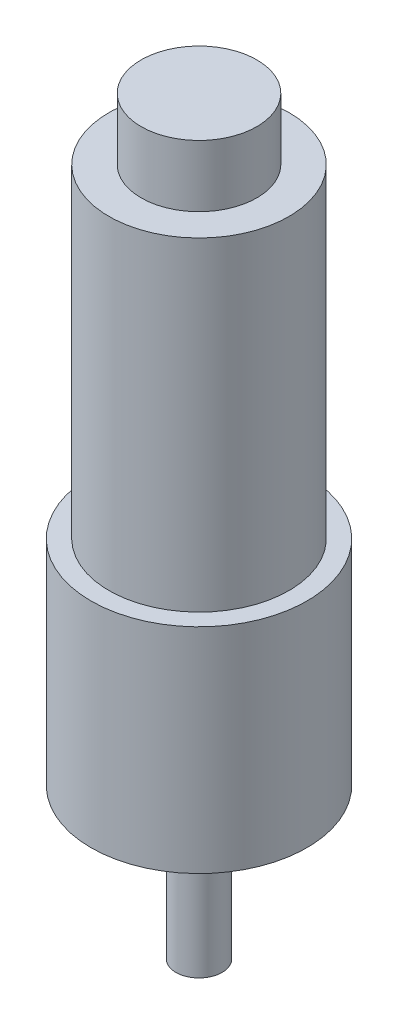
ISO-10303-21;
HEADER;
FILE_DESCRIPTION(('STEP AP214'),'2;1');
FILE_NAME('part.step','',(''),(''),'','','');
FILE_SCHEMA(('AUTOMOTIVE_DESIGN { 1 0 10303 214 1 1 1 1 }'));
ENDSEC;
DATA;
#1=APPLICATION_CONTEXT('core data for automotive mechanical design processes');
#2=APPLICATION_PROTOCOL_DEFINITION('international standard','automotive_design',2000,#1);
#3=PRODUCT_CONTEXT('',#1,'mechanical');
#4=PRODUCT('Part','Part','',(#3));
#5=PRODUCT_RELATED_PRODUCT_CATEGORY('part','',(#4));
#6=PRODUCT_DEFINITION_FORMATION('','',#4);
#7=PRODUCT_DEFINITION_CONTEXT('part definition',#1,'design');
#8=PRODUCT_DEFINITION('design','',#6,#7);
#9=PRODUCT_DEFINITION_SHAPE('','',#8);
#10=(LENGTH_UNIT() NAMED_UNIT(*) SI_UNIT(.MILLI.,.METRE.));
#11=(NAMED_UNIT(*) PLANE_ANGLE_UNIT() SI_UNIT($,.RADIAN.));
#12=(NAMED_UNIT(*) SI_UNIT($,.STERADIAN.) SOLID_ANGLE_UNIT());
#13=UNCERTAINTY_MEASURE_WITH_UNIT(LENGTH_MEASURE(1.E-05),#10,'distance_accuracy_value','');
#14=(GEOMETRIC_REPRESENTATION_CONTEXT(3) GLOBAL_UNCERTAINTY_ASSIGNED_CONTEXT((#13)) GLOBAL_UNIT_ASSIGNED_CONTEXT((#10,
#11,#12)) REPRESENTATION_CONTEXT('',''));
#15=CARTESIAN_POINT('',(0.,0.,0.));
#16=DIRECTION('',(0.,0.,1.));
#17=DIRECTION('',(1.,0.,0.));
#18=AXIS2_PLACEMENT_3D('',#15,#16,#17);
#19=CARTESIAN_POINT('',(0.,-1.,0.));
#20=DIRECTION('',(0.,-1.,0.));
#21=DIRECTION('',(0.,0.,-1.));
#22=AXIS2_PLACEMENT_3D('',#19,#20,#21);
#23=PLANE('',#22);
#24=CARTESIAN_POINT('',(0.,-1.,0.));
#25=DIRECTION('',(0.,-1.,0.));
#26=DIRECTION('',(0.,0.,-1.));
#27=AXIS2_PLACEMENT_3D('',#24,#25,#26);
#28=CIRCLE('',#27,8.);
#29=CARTESIAN_POINT('',(0.,-1.,-8.));
#30=VERTEX_POINT('',#29);
#31=EDGE_CURVE('E76',#30,#30,#28,.T.);
#32=ORIENTED_EDGE('',*,*,#31,.T.);
#33=EDGE_LOOP('',(#32));
#34=FACE_BOUND('',#33,.T.);
#35=CARTESIAN_POINT('',(0.,-1.,0.));
#36=DIRECTION('',(0.,-1.,0.));
#37=DIRECTION('',(0.,0.,-1.));
#38=AXIS2_PLACEMENT_3D('',#35,#36,#37);
#39=CIRCLE('',#38,3.);
#40=CARTESIAN_POINT('',(0.,-1.,-3.));
#41=VERTEX_POINT('',#40);
#42=EDGE_CURVE('E73',#41,#41,#39,.T.);
#43=ORIENTED_EDGE('',*,*,#42,.F.);
#44=EDGE_LOOP('',(#43));
#45=FACE_BOUND('',#44,.T.);
#46=ADVANCED_FACE('F34',(#34,#45),#23,.T.);
#47=CARTESIAN_POINT('',(0.,0.,0.));
#48=DIRECTION('',(0.,1.,0.));
#49=DIRECTION('',(0.,0.,1.));
#50=AXIS2_PLACEMENT_3D('',#47,#48,#49);
#51=PLANE('',#50);
#52=CARTESIAN_POINT('',(-11.,0.,1.1521895091661E-13));
#53=DIRECTION('',(0.,-1.,0.));
#54=DIRECTION('',(0.,0.,-1.));
#55=AXIS2_PLACEMENT_3D('',#52,#53,#54);
#56=CIRCLE('',#55,1.5);
#57=CARTESIAN_POINT('',(-11.,0.,-1.49999999999988));
#58=VERTEX_POINT('',#57);
#59=EDGE_CURVE('E175',#58,#58,#56,.T.);
#60=ORIENTED_EDGE('',*,*,#59,.F.);
#61=EDGE_LOOP('',(#60));
#62=FACE_BOUND('',#61,.T.);
#63=CARTESIAN_POINT('',(2.67863222959506E-13,0.,-11.));
#64=DIRECTION('',(0.,-1.,0.));
#65=DIRECTION('',(0.,0.,-1.));
#66=AXIS2_PLACEMENT_3D('',#63,#64,#65);
#67=CIRCLE('',#66,1.5);
#68=CARTESIAN_POINT('',(2.67863222959506E-13,0.,-12.5));
#69=VERTEX_POINT('',#68);
#70=EDGE_CURVE('E174',#69,#69,#67,.T.);
#71=ORIENTED_EDGE('',*,*,#70,.F.);
#72=EDGE_LOOP('',(#71));
#73=FACE_BOUND('',#72,.T.);
#74=CARTESIAN_POINT('',(11.,0.,0.));
#75=DIRECTION('',(0.,-1.,0.));
#76=DIRECTION('',(0.,0.,-1.));
#77=AXIS2_PLACEMENT_3D('',#74,#75,#76);
#78=CIRCLE('',#77,1.5);
#79=CARTESIAN_POINT('',(11.,0.,-1.50000000000004));
#80=VERTEX_POINT('',#79);
#81=EDGE_CURVE('E184',#80,#80,#78,.T.);
#82=ORIENTED_EDGE('',*,*,#81,.F.);
#83=EDGE_LOOP('',(#82));
#84=FACE_BOUND('',#83,.T.);
#85=CARTESIAN_POINT('',(0.,0.,11.));
#86=DIRECTION('',(0.,-1.,0.));
#87=DIRECTION('',(0.,0.,-1.));
#88=AXIS2_PLACEMENT_3D('',#85,#86,#87);
#89=CIRCLE('',#88,1.5);
#90=CARTESIAN_POINT('',(0.,0.,9.5));
#91=VERTEX_POINT('',#90);
#92=EDGE_CURVE('E189',#91,#91,#89,.T.);
#93=ORIENTED_EDGE('',*,*,#92,.F.);
#94=EDGE_LOOP('',(#93));
#95=FACE_BOUND('',#94,.T.);
#96=CARTESIAN_POINT('',(0.,0.,0.));
#97=DIRECTION('',(0.,1.,0.));
#98=DIRECTION('',(0.,0.,1.));
#99=AXIS2_PLACEMENT_3D('',#96,#97,#98);
#100=CIRCLE('',#99,14.);
#101=CARTESIAN_POINT('',(0.,0.,14.));
#102=VERTEX_POINT('',#101);
#103=EDGE_CURVE('E94',#102,#102,#100,.T.);
#104=ORIENTED_EDGE('',*,*,#103,.F.);
#105=EDGE_LOOP('',(#104));
#106=FACE_BOUND('',#105,.T.);
#107=CARTESIAN_POINT('',(0.,0.,0.));
#108=DIRECTION('',(0.,1.,0.));
#109=DIRECTION('',(0.,0.,1.));
#110=AXIS2_PLACEMENT_3D('',#107,#108,#109);
#111=CIRCLE('',#110,8.);
#112=CARTESIAN_POINT('',(0.,0.,8.));
#113=VERTEX_POINT('',#112);
#114=EDGE_CURVE('E12',#113,#113,#111,.F.);
#115=ORIENTED_EDGE('',*,*,#114,.F.);
#116=EDGE_LOOP('',(#115));
#117=FACE_BOUND('',#116,.T.);
#118=ADVANCED_FACE('F102',(#62,#73,#84,#95,#106,#117),#51,.F.);
#119=CARTESIAN_POINT('',(0.,69.7,0.));
#120=DIRECTION('',(0.,1.,0.));
#121=DIRECTION('',(0.,0.,1.));
#122=AXIS2_PLACEMENT_3D('',#119,#120,#121);
#123=PLANE('',#122);
#124=CARTESIAN_POINT('',(0.,69.7,0.));
#125=DIRECTION('',(0.,1.,0.));
#126=DIRECTION('',(0.,0.,1.));
#127=AXIS2_PLACEMENT_3D('',#124,#125,#126);
#128=CIRCLE('',#127,11.6696321259711);
#129=CARTESIAN_POINT('',(0.,69.7,-11.6696321259711));
#130=VERTEX_POINT('',#129);
#131=EDGE_CURVE('E91',#130,#130,#128,.T.);
#132=ORIENTED_EDGE('',*,*,#131,.T.);
#133=EDGE_LOOP('',(#132));
#134=FACE_BOUND('',#133,.T.);
#135=CARTESIAN_POINT('',(0.,69.7,0.));
#136=DIRECTION('',(0.,1.,0.));
#137=DIRECTION('',(0.,0.,1.));
#138=AXIS2_PLACEMENT_3D('',#135,#136,#137);
#139=CIRCLE('',#138,7.5);
#140=CARTESIAN_POINT('',(0.,69.7,7.5));
#141=VERTEX_POINT('',#140);
#142=EDGE_CURVE('E79',#141,#141,#139,.T.);
#143=ORIENTED_EDGE('',*,*,#142,.F.);
#144=EDGE_LOOP('',(#143));
#145=FACE_BOUND('',#144,.T.);
#146=ADVANCED_FACE('F105',(#134,#145),#123,.T.);
#147=CARTESIAN_POINT('',(0.,27.7,0.));
#148=DIRECTION('',(0.,1.,0.));
#149=DIRECTION('',(0.,0.,1.));
#150=AXIS2_PLACEMENT_3D('',#147,#148,#149);
#151=PLANE('',#150);
#152=CARTESIAN_POINT('',(0.,27.7,0.));
#153=DIRECTION('',(0.,1.,0.));
#154=DIRECTION('',(0.,0.,1.));
#155=AXIS2_PLACEMENT_3D('',#152,#153,#154);
#156=CIRCLE('',#155,14.);
#157=CARTESIAN_POINT('',(0.,27.7,14.));
#158=VERTEX_POINT('',#157);
#159=EDGE_CURVE('E42',#158,#158,#156,.T.);
#160=ORIENTED_EDGE('',*,*,#159,.T.);
#161=EDGE_LOOP('',(#160));
#162=FACE_BOUND('',#161,.T.);
#163=CARTESIAN_POINT('',(0.,27.7,0.));
#164=DIRECTION('',(0.,1.,0.));
#165=DIRECTION('',(0.,0.,1.));
#166=AXIS2_PLACEMENT_3D('',#163,#164,#165);
#167=CIRCLE('',#166,11.6696321259711);
#168=CARTESIAN_POINT('',(0.,27.7,-11.6696321259711));
#169=VERTEX_POINT('',#168);
#170=EDGE_CURVE('E88',#169,#169,#167,.T.);
#171=ORIENTED_EDGE('',*,*,#170,.F.);
#172=EDGE_LOOP('',(#171));
#173=FACE_BOUND('',#172,.T.);
#174=ADVANCED_FACE('F292',(#162,#173),#151,.T.);
#175=CARTESIAN_POINT('',(0.,27.7,0.));
#176=DIRECTION('',(0.,-1.,0.));
#177=DIRECTION('',(0.,0.,-1.));
#178=AXIS2_PLACEMENT_3D('',#175,#176,#177);
#179=CYLINDRICAL_SURFACE('',#178,14.);
#180=ORIENTED_EDGE('',*,*,#159,.F.);
#181=EDGE_LOOP('',(#180));
#182=FACE_BOUND('',#181,.T.);
#183=ORIENTED_EDGE('',*,*,#103,.T.);
#184=EDGE_LOOP('',(#183));
#185=FACE_BOUND('',#184,.T.);
#186=ADVANCED_FACE('F36',(#182,#185),#179,.T.);
#187=CARTESIAN_POINT('',(0.,69.7,0.));
#188=DIRECTION('',(0.,-1.,0.));
#189=DIRECTION('',(0.,0.,-1.));
#190=AXIS2_PLACEMENT_3D('',#187,#188,#189);
#191=CYLINDRICAL_SURFACE('',#190,11.6696321259711);
#192=CARTESIAN_POINT('',(0.,69.7,-11.6696321259711));
#193=CARTESIAN_POINT('',(0.,69.2625,-11.6696321259711));
#194=CARTESIAN_POINT('',(0.,68.825,-11.6696321259711));
#195=CARTESIAN_POINT('',(0.,67.95,-11.6696321259711));
#196=CARTESIAN_POINT('',(0.,67.5125,-11.6696321259711));
#197=CARTESIAN_POINT('',(0.,66.6375,-11.6696321259711));
#198=CARTESIAN_POINT('',(0.,66.2,-11.6696321259711));
#199=CARTESIAN_POINT('',(0.,65.325,-11.6696321259711));
#200=CARTESIAN_POINT('',(0.,64.8875,-11.6696321259711));
#201=CARTESIAN_POINT('',(0.,64.0125,-11.6696321259711));
#202=CARTESIAN_POINT('',(0.,63.575,-11.6696321259711));
#203=CARTESIAN_POINT('',(0.,62.7,-11.6696321259711));
#204=CARTESIAN_POINT('',(0.,62.2625,-11.6696321259711));
#205=CARTESIAN_POINT('',(0.,61.3875,-11.6696321259711));
#206=CARTESIAN_POINT('',(0.,60.95,-11.6696321259711));
#207=CARTESIAN_POINT('',(0.,60.075,-11.6696321259711));
#208=CARTESIAN_POINT('',(0.,59.6375,-11.6696321259711));
#209=CARTESIAN_POINT('',(0.,58.7625,-11.6696321259711));
#210=CARTESIAN_POINT('',(0.,58.325,-11.6696321259711));
#211=CARTESIAN_POINT('',(0.,57.45,-11.6696321259711));
#212=CARTESIAN_POINT('',(0.,57.0125,-11.6696321259711));
#213=CARTESIAN_POINT('',(0.,56.1375,-11.6696321259711));
#214=CARTESIAN_POINT('',(0.,55.7,-11.6696321259711));
#215=CARTESIAN_POINT('',(0.,54.825,-11.6696321259711));
#216=CARTESIAN_POINT('',(0.,54.3875,-11.6696321259711));
#217=CARTESIAN_POINT('',(0.,53.5125,-11.6696321259711));
#218=CARTESIAN_POINT('',(0.,53.075,-11.6696321259711));
#219=CARTESIAN_POINT('',(0.,52.2,-11.6696321259711));
#220=CARTESIAN_POINT('',(0.,51.7625,-11.6696321259711));
#221=CARTESIAN_POINT('',(0.,50.8875,-11.6696321259711));
#222=CARTESIAN_POINT('',(0.,50.45,-11.6696321259711));
#223=CARTESIAN_POINT('',(0.,49.575,-11.6696321259711));
#224=CARTESIAN_POINT('',(0.,49.1375,-11.6696321259711));
#225=CARTESIAN_POINT('',(0.,48.2625,-11.6696321259711));
#226=CARTESIAN_POINT('',(0.,47.825,-11.6696321259711));
#227=CARTESIAN_POINT('',(0.,46.95,-11.6696321259711));
#228=CARTESIAN_POINT('',(0.,46.5125,-11.6696321259711));
#229=CARTESIAN_POINT('',(0.,45.6375,-11.6696321259711));
#230=CARTESIAN_POINT('',(0.,45.2,-11.6696321259711));
#231=CARTESIAN_POINT('',(0.,44.325,-11.6696321259711));
#232=CARTESIAN_POINT('',(0.,43.8875,-11.6696321259711));
#233=CARTESIAN_POINT('',(0.,43.0125,-11.6696321259711));
#234=CARTESIAN_POINT('',(0.,42.575,-11.6696321259711));
#235=CARTESIAN_POINT('',(0.,41.7,-11.6696321259711));
#236=CARTESIAN_POINT('',(0.,41.2625,-11.6696321259711));
#237=CARTESIAN_POINT('',(0.,40.3875,-11.6696321259711));
#238=CARTESIAN_POINT('',(0.,39.95,-11.6696321259711));
#239=CARTESIAN_POINT('',(0.,39.075,-11.6696321259711));
#240=CARTESIAN_POINT('',(0.,38.6375,-11.6696321259711));
#241=CARTESIAN_POINT('',(0.,37.7625,-11.6696321259711));
#242=CARTESIAN_POINT('',(0.,37.325,-11.6696321259711));
#243=CARTESIAN_POINT('',(0.,36.45,-11.6696321259711));
#244=CARTESIAN_POINT('',(0.,36.0125,-11.6696321259711));
#245=CARTESIAN_POINT('',(0.,35.1375,-11.6696321259711));
#246=CARTESIAN_POINT('',(0.,34.7,-11.6696321259711));
#247=CARTESIAN_POINT('',(0.,33.825,-11.6696321259711));
#248=CARTESIAN_POINT('',(0.,33.3875,-11.6696321259711));
#249=CARTESIAN_POINT('',(0.,32.5125,-11.6696321259711));
#250=CARTESIAN_POINT('',(0.,32.075,-11.6696321259711));
#251=CARTESIAN_POINT('',(0.,31.2,-11.6696321259711));
#252=CARTESIAN_POINT('',(0.,30.7625,-11.6696321259711));
#253=CARTESIAN_POINT('',(0.,29.8875,-11.6696321259711));
#254=CARTESIAN_POINT('',(0.,29.45,-11.6696321259711));
#255=CARTESIAN_POINT('',(0.,28.575,-11.6696321259711));
#256=CARTESIAN_POINT('',(0.,28.1375,-11.6696321259711));
#257=CARTESIAN_POINT('',(0.,27.7,-11.6696321259711));
#258=B_SPLINE_CURVE_WITH_KNOTS('',3,(#192,#193,#194,#195,#196,#197,#198,#199,#200,#201,#202,
#203,#204,#205,#206,#207,#208,#209,#210,#211,#212,#213,#214,#215,#216,#217,#218,#219,#220,#221,
#222,#223,#224,#225,#226,#227,#228,#229,#230,#231,#232,#233,#234,#235,#236,#237,#238,#239,#240,
#241,#242,#243,#244,#245,#246,#247,#248,#249,#250,#251,#252,#253,#254,#255,#256,#257),
.UNSPECIFIED.,.F.,.F.,(4,2,2,2,2,2,2,2,2,2,2,2,2,2,2,2,2,2,2,2,2,2,2,2,2,2,2,2,2,2,2,2,4),(0.,
1.31249999999999,2.62499999999999,3.9375,5.24999999999999,6.5625,7.87499999999999,
9.18749999999999,10.5,11.8125,13.125,14.4375,15.75,17.0625,18.375,19.6875,21.,22.3125,23.625,
24.9375,26.25,27.5625,28.875,30.1875,31.5,32.8125,34.125,35.4375,36.75,38.0625,39.375,40.6875,
42.),.UNSPECIFIED.);
#259=EDGE_CURVE('BSEAM281',#130,#169,#258,.T.);
#260=ORIENTED_EDGE('',*,*,#131,.F.);
#261=ORIENTED_EDGE('',*,*,#170,.T.);
#262=ORIENTED_EDGE('',*,*,#259,.T.);
#263=ORIENTED_EDGE('',*,*,#259,.F.);
#264=EDGE_LOOP('',(#260,#262,#261,#263));
#265=FACE_BOUND('',#264,.T.);
#266=ADVANCED_FACE('F281',(#265),#191,.T.);
#267=CARTESIAN_POINT('',(0.,77.7,0.));
#268=DIRECTION('',(0.,-1.,0.));
#269=DIRECTION('',(0.,0.,-1.));
#270=AXIS2_PLACEMENT_3D('',#267,#268,#269);
#271=CYLINDRICAL_SURFACE('',#270,7.5);
#272=CARTESIAN_POINT('',(0.,77.7,0.));
#273=DIRECTION('',(0.,1.,0.));
#274=DIRECTION('',(0.,0.,1.));
#275=AXIS2_PLACEMENT_3D('',#272,#273,#274);
#276=CIRCLE('',#275,7.5);
#277=CARTESIAN_POINT('',(0.,77.7,7.5));
#278=VERTEX_POINT('',#277);
#279=EDGE_CURVE('E85',#278,#278,#276,.T.);
#280=ORIENTED_EDGE('',*,*,#279,.F.);
#281=EDGE_LOOP('',(#280));
#282=FACE_BOUND('',#281,.T.);
#283=ORIENTED_EDGE('',*,*,#142,.T.);
#284=EDGE_LOOP('',(#283));
#285=FACE_BOUND('',#284,.T.);
#286=ADVANCED_FACE('F119',(#282,#285),#271,.T.);
#287=CARTESIAN_POINT('',(0.,77.7,0.));
#288=DIRECTION('',(0.,1.,0.));
#289=DIRECTION('',(0.,0.,1.));
#290=AXIS2_PLACEMENT_3D('',#287,#288,#289);
#291=PLANE('',#290);
#292=ORIENTED_EDGE('',*,*,#279,.T.);
#293=EDGE_LOOP('',(#292));
#294=FACE_BOUND('',#293,.T.);
#295=ADVANCED_FACE('F111',(#294),#291,.T.);
#296=CARTESIAN_POINT('',(0.,-1.,0.));
#297=DIRECTION('',(0.,1.,0.));
#298=DIRECTION('',(0.,0.,1.));
#299=AXIS2_PLACEMENT_3D('',#296,#297,#298);
#300=CYLINDRICAL_SURFACE('',#299,8.);
#301=ORIENTED_EDGE('',*,*,#31,.F.);
#302=EDGE_LOOP('',(#301));
#303=FACE_BOUND('',#302,.T.);
#304=ORIENTED_EDGE('',*,*,#114,.T.);
#305=EDGE_LOOP('',(#304));
#306=FACE_BOUND('',#305,.T.);
#307=ADVANCED_FACE('F109',(#303,#306),#300,.T.);
#308=CARTESIAN_POINT('',(0.,-19.5,0.));
#309=DIRECTION('',(0.,1.,0.));
#310=DIRECTION('',(0.,0.,1.));
#311=AXIS2_PLACEMENT_3D('',#308,#309,#310);
#312=CYLINDRICAL_SURFACE('',#311,3.);
#313=CARTESIAN_POINT('',(0.,-19.5,0.));
#314=DIRECTION('',(0.,-1.,0.));
#315=DIRECTION('',(0.,0.,-1.));
#316=AXIS2_PLACEMENT_3D('',#313,#314,#315);
#317=CIRCLE('',#316,3.);
#318=CARTESIAN_POINT('',(1.6583123951777,-19.5,-2.5));
#319=VERTEX_POINT('',#318);
#320=CARTESIAN_POINT('',(-1.6583123951777,-19.5,-2.5));
#321=VERTEX_POINT('',#320);
#322=EDGE_CURVE('E72',#319,#321,#317,.T.);
#323=ORIENTED_EDGE('',*,*,#322,.F.);
#324=DIRECTION('',(0.,-1.,0.));
#325=VECTOR('',#324,1.);
#326=CARTESIAN_POINT('',(1.6583123951777,-7.5,-2.5));
#327=LINE('',#326,#325);
#328=CARTESIAN_POINT('',(1.6583123951777,-7.5,-2.5));
#329=VERTEX_POINT('',#328);
#330=EDGE_CURVE('E49',#329,#319,#327,.T.);
#331=ORIENTED_EDGE('',*,*,#330,.F.);
#332=CARTESIAN_POINT('',(0.,-7.5,0.));
#333=DIRECTION('',(0.,-1.,0.));
#334=DIRECTION('',(0.,0.,-1.));
#335=AXIS2_PLACEMENT_3D('',#332,#333,#334);
#336=CIRCLE('',#335,3.);
#337=CARTESIAN_POINT('',(-1.6583123951777,-7.5,-2.5));
#338=VERTEX_POINT('',#337);
#339=EDGE_CURVE('E65',#338,#329,#336,.T.);
#340=ORIENTED_EDGE('',*,*,#339,.F.);
#341=DIRECTION('',(0.,-1.,0.));
#342=VECTOR('',#341,1.);
#343=CARTESIAN_POINT('',(-1.6583123951777,-7.5,-2.5));
#344=LINE('',#343,#342);
#345=EDGE_CURVE('E55',#338,#321,#344,.T.);
#346=ORIENTED_EDGE('',*,*,#345,.T.);
#347=EDGE_LOOP('',(#323,#331,#340,#346));
#348=FACE_BOUND('',#347,.T.);
#349=ORIENTED_EDGE('',*,*,#42,.T.);
#350=EDGE_LOOP('',(#349));
#351=FACE_BOUND('',#350,.T.);
#352=ADVANCED_FACE('F70',(#348,#351),#312,.T.);
#353=CARTESIAN_POINT('',(0.,-19.5,0.));
#354=DIRECTION('',(0.,-1.,0.));
#355=DIRECTION('',(0.,0.,-1.));
#356=AXIS2_PLACEMENT_3D('',#353,#354,#355);
#357=PLANE('',#356);
#358=DIRECTION('',(-1.,0.,0.));
#359=VECTOR('',#358,1.);
#360=CARTESIAN_POINT('',(-1.6583123951777,-19.5,-2.5));
#361=LINE('',#360,#359);
#362=EDGE_CURVE('E60',#319,#321,#361,.T.);
#363=ORIENTED_EDGE('',*,*,#362,.F.);
#364=ORIENTED_EDGE('',*,*,#322,.T.);
#365=EDGE_LOOP('',(#363,#364));
#366=FACE_BOUND('',#365,.T.);
#367=ADVANCED_FACE('F75',(#366),#357,.T.);
#368=CARTESIAN_POINT('',(-1.6583123951777,-7.5,-2.5));
#369=DIRECTION('',(0.,0.,1.));
#370=DIRECTION('',(1.,0.,0.));
#371=AXIS2_PLACEMENT_3D('',#368,#369,#370);
#372=PLANE('',#371);
#373=ORIENTED_EDGE('',*,*,#362,.T.);
#374=ORIENTED_EDGE('',*,*,#345,.F.);
#375=DIRECTION('',(-1.,0.,0.));
#376=VECTOR('',#375,1.);
#377=CARTESIAN_POINT('',(-1.6583123951777,-7.5,-2.5));
#378=LINE('',#377,#376);
#379=EDGE_CURVE('E197',#329,#338,#378,.T.);
#380=ORIENTED_EDGE('',*,*,#379,.F.);
#381=ORIENTED_EDGE('',*,*,#330,.T.);
#382=EDGE_LOOP('',(#373,#374,#380,#381));
#383=FACE_BOUND('',#382,.T.);
#384=ADVANCED_FACE('F61',(#383),#372,.F.);
#385=CARTESIAN_POINT('',(0.,-7.5,0.));
#386=DIRECTION('',(0.,-1.,0.));
#387=DIRECTION('',(0.,0.,-1.));
#388=AXIS2_PLACEMENT_3D('',#385,#386,#387);
#389=PLANE('',#388);
#390=ORIENTED_EDGE('',*,*,#339,.T.);
#391=ORIENTED_EDGE('',*,*,#379,.T.);
#392=EDGE_LOOP('',(#390,#391));
#393=FACE_BOUND('',#392,.T.);
#394=ADVANCED_FACE('F134',(#393),#389,.T.);
#395=CARTESIAN_POINT('',(0.,4.,11.));
#396=DIRECTION('',(0.,-1.,0.));
#397=DIRECTION('',(0.,0.,-1.));
#398=AXIS2_PLACEMENT_3D('',#395,#396,#397);
#399=CYLINDRICAL_SURFACE('',#398,1.5);
#400=CARTESIAN_POINT('',(0.,4.,11.));
#401=DIRECTION('',(0.,-1.,0.));
#402=DIRECTION('',(0.,0.,-1.));
#403=AXIS2_PLACEMENT_3D('',#400,#401,#402);
#404=CIRCLE('',#403,1.5);
#405=CARTESIAN_POINT('',(0.,4.,9.5));
#406=VERTEX_POINT('',#405);
#407=EDGE_CURVE('E66',#406,#406,#404,.T.);
#408=ORIENTED_EDGE('',*,*,#407,.F.);
#409=EDGE_LOOP('',(#408));
#410=FACE_BOUND('',#409,.T.);
#411=ORIENTED_EDGE('',*,*,#92,.T.);
#412=EDGE_LOOP('',(#411));
#413=FACE_BOUND('',#412,.T.);
#414=ADVANCED_FACE('F137',(#410,#413),#399,.F.);
#415=CARTESIAN_POINT('',(0.,4.,11.));
#416=DIRECTION('',(0.,-1.,0.));
#417=DIRECTION('',(0.,0.,-1.));
#418=AXIS2_PLACEMENT_3D('',#415,#416,#417);
#419=PLANE('',#418);
#420=ORIENTED_EDGE('',*,*,#407,.T.);
#421=EDGE_LOOP('',(#420));
#422=FACE_BOUND('',#421,.T.);
#423=ADVANCED_FACE('F141',(#422),#419,.T.);
#424=CARTESIAN_POINT('',(11.,4.,0.));
#425=DIRECTION('',(0.,-1.,0.));
#426=DIRECTION('',(0.,0.,-1.));
#427=AXIS2_PLACEMENT_3D('',#424,#425,#426);
#428=CYLINDRICAL_SURFACE('',#427,1.5);
#429=CARTESIAN_POINT('',(11.,4.,0.));
#430=DIRECTION('',(0.,-1.,0.));
#431=DIRECTION('',(0.,0.,-1.));
#432=AXIS2_PLACEMENT_3D('',#429,#430,#431);
#433=CIRCLE('',#432,1.5);
#434=CARTESIAN_POINT('',(11.,4.,-1.50000000000004));
#435=VERTEX_POINT('',#434);
#436=EDGE_CURVE('E186',#435,#435,#433,.T.);
#437=ORIENTED_EDGE('',*,*,#436,.F.);
#438=EDGE_LOOP('',(#437));
#439=FACE_BOUND('',#438,.T.);
#440=ORIENTED_EDGE('',*,*,#81,.T.);
#441=EDGE_LOOP('',(#440));
#442=FACE_BOUND('',#441,.T.);
#443=ADVANCED_FACE('F145',(#439,#442),#428,.F.);
#444=CARTESIAN_POINT('',(11.,4.,0.));
#445=DIRECTION('',(0.,-1.,0.));
#446=DIRECTION('',(0.,0.,-1.));
#447=AXIS2_PLACEMENT_3D('',#444,#445,#446);
#448=PLANE('',#447);
#449=ORIENTED_EDGE('',*,*,#436,.T.);
#450=EDGE_LOOP('',(#449));
#451=FACE_BOUND('',#450,.T.);
#452=ADVANCED_FACE('F149',(#451),#448,.T.);
#453=CARTESIAN_POINT('',(2.67863222959506E-13,4.,-11.));
#454=DIRECTION('',(0.,-1.,0.));
#455=DIRECTION('',(0.,0.,-1.));
#456=AXIS2_PLACEMENT_3D('',#453,#454,#455);
#457=CYLINDRICAL_SURFACE('',#456,1.5);
#458=CARTESIAN_POINT('',(2.67863222959506E-13,4.,-11.));
#459=DIRECTION('',(0.,-1.,0.));
#460=DIRECTION('',(0.,0.,-1.));
#461=AXIS2_PLACEMENT_3D('',#458,#459,#460);
#462=CIRCLE('',#461,1.5);
#463=CARTESIAN_POINT('',(2.67863222959506E-13,4.,-12.5));
#464=VERTEX_POINT('',#463);
#465=EDGE_CURVE('E178',#464,#464,#462,.T.);
#466=ORIENTED_EDGE('',*,*,#465,.F.);
#467=EDGE_LOOP('',(#466));
#468=FACE_BOUND('',#467,.T.);
#469=ORIENTED_EDGE('',*,*,#70,.T.);
#470=EDGE_LOOP('',(#469));
#471=FACE_BOUND('',#470,.T.);
#472=ADVANCED_FACE('F153',(#468,#471),#457,.F.);
#473=CARTESIAN_POINT('',(2.67863222959506E-13,4.,-11.));
#474=DIRECTION('',(0.,-1.,0.));
#475=DIRECTION('',(0.,0.,-1.));
#476=AXIS2_PLACEMENT_3D('',#473,#474,#475);
#477=PLANE('',#476);
#478=ORIENTED_EDGE('',*,*,#465,.T.);
#479=EDGE_LOOP('',(#478));
#480=FACE_BOUND('',#479,.T.);
#481=ADVANCED_FACE('F157',(#480),#477,.T.);
#482=CARTESIAN_POINT('',(-11.,4.,1.1521895091661E-13));
#483=DIRECTION('',(0.,-1.,0.));
#484=DIRECTION('',(0.,0.,-1.));
#485=AXIS2_PLACEMENT_3D('',#482,#483,#484);
#486=CYLINDRICAL_SURFACE('',#485,1.5);
#487=CARTESIAN_POINT('',(-11.,4.,1.1521895091661E-13));
#488=DIRECTION('',(0.,-1.,0.));
#489=DIRECTION('',(0.,0.,-1.));
#490=AXIS2_PLACEMENT_3D('',#487,#488,#489);
#491=CIRCLE('',#490,1.5);
#492=CARTESIAN_POINT('',(-11.,4.,-1.49999999999988));
#493=VERTEX_POINT('',#492);
#494=EDGE_CURVE('E173',#493,#493,#491,.T.);
#495=ORIENTED_EDGE('',*,*,#494,.F.);
#496=EDGE_LOOP('',(#495));
#497=FACE_BOUND('',#496,.T.);
#498=ORIENTED_EDGE('',*,*,#59,.T.);
#499=EDGE_LOOP('',(#498));
#500=FACE_BOUND('',#499,.T.);
#501=ADVANCED_FACE('F161',(#497,#500),#486,.F.);
#502=CARTESIAN_POINT('',(-11.,4.,1.1521895091661E-13));
#503=DIRECTION('',(0.,-1.,0.));
#504=DIRECTION('',(0.,0.,-1.));
#505=AXIS2_PLACEMENT_3D('',#502,#503,#504);
#506=PLANE('',#505);
#507=ORIENTED_EDGE('',*,*,#494,.T.);
#508=EDGE_LOOP('',(#507));
#509=FACE_BOUND('',#508,.T.);
#510=ADVANCED_FACE('F165',(#509),#506,.T.);
#511=CLOSED_SHELL('',(#46,#118,#146,#174,#186,#266,#286,#295,#307,#352,#367,#384,#394,#414,#423,
#443,#452,#472,#481,#501,#510));
#512=MANIFOLD_SOLID_BREP('B2',#511);
#513=ADVANCED_BREP_SHAPE_REPRESENTATION('',(#18,#512),#14);
#514=SHAPE_DEFINITION_REPRESENTATION(#9,#513);
ENDSEC;
END-ISO-10303-21;
